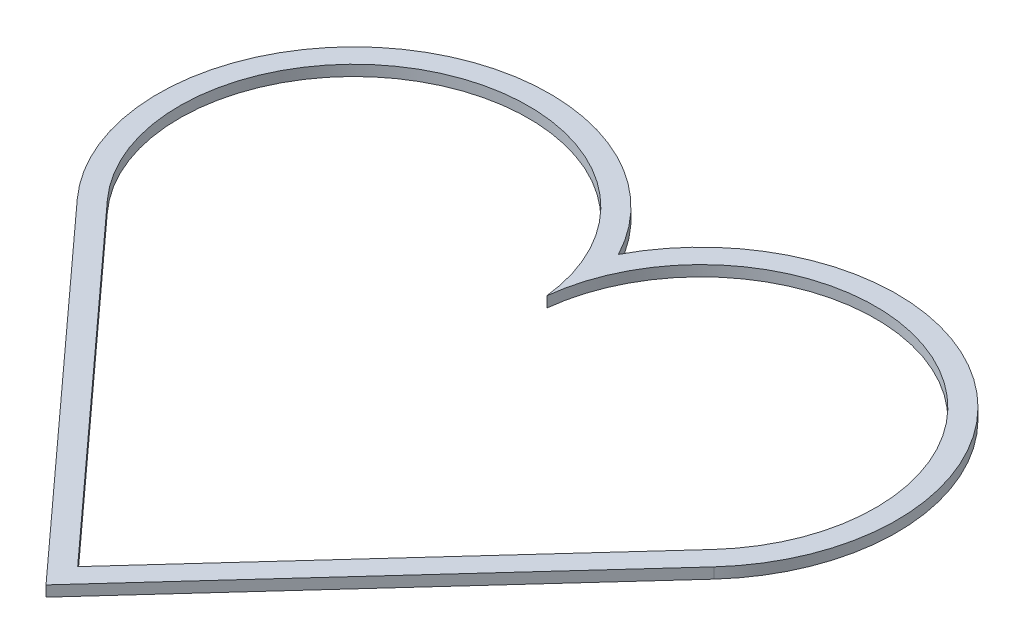
ISO-10303-21;
HEADER;
FILE_DESCRIPTION(('STEP AP214'),'2;1');
FILE_NAME('part.step','',(''),(''),'','','');
FILE_SCHEMA(('AUTOMOTIVE_DESIGN { 1 0 10303 214 1 1 1 1 }'));
ENDSEC;
DATA;
#1=APPLICATION_CONTEXT('core data for automotive mechanical design processes');
#2=APPLICATION_PROTOCOL_DEFINITION('international standard','automotive_design',2000,#1);
#3=PRODUCT_CONTEXT('',#1,'mechanical');
#4=PRODUCT('Part','Part','',(#3));
#5=PRODUCT_RELATED_PRODUCT_CATEGORY('part','',(#4));
#6=PRODUCT_DEFINITION_FORMATION('','',#4);
#7=PRODUCT_DEFINITION_CONTEXT('part definition',#1,'design');
#8=PRODUCT_DEFINITION('design','',#6,#7);
#9=PRODUCT_DEFINITION_SHAPE('','',#8);
#10=(LENGTH_UNIT() NAMED_UNIT(*) SI_UNIT(.MILLI.,.METRE.));
#11=(NAMED_UNIT(*) PLANE_ANGLE_UNIT() SI_UNIT($,.RADIAN.));
#12=(NAMED_UNIT(*) SI_UNIT($,.STERADIAN.) SOLID_ANGLE_UNIT());
#13=UNCERTAINTY_MEASURE_WITH_UNIT(LENGTH_MEASURE(1.E-05),#10,'distance_accuracy_value','');
#14=(GEOMETRIC_REPRESENTATION_CONTEXT(3) GLOBAL_UNCERTAINTY_ASSIGNED_CONTEXT((#13)) GLOBAL_UNIT_ASSIGNED_CONTEXT((#10,
#11,#12)) REPRESENTATION_CONTEXT('',''));
#15=CARTESIAN_POINT('',(0.,0.,0.));
#16=DIRECTION('',(0.,0.,1.));
#17=DIRECTION('',(1.,0.,0.));
#18=AXIS2_PLACEMENT_3D('',#15,#16,#17);
#19=CARTESIAN_POINT('',(-16.2888737415858,1.,-42.2315368312349));
#20=DIRECTION('',(0.,-1.,0.));
#21=DIRECTION('',(0.,0.,-1.));
#22=AXIS2_PLACEMENT_3D('',#19,#20,#21);
#23=PLANE('',#22);
#24=DIRECTION('',(0.673292320058697,0.,0.739376393827918));
#25=VECTOR('',#24,1.);
#26=CARTESIAN_POINT('',(0.,1.,2.97047796390376));
#27=LINE('',#26,#25);
#28=CARTESIAN_POINT('',(-29.8864201822029,1.,-29.8493135596602));
#29=VERTEX_POINT('',#28);
#30=CARTESIAN_POINT('',(0.,1.,2.97047796390376));
#31=VERTEX_POINT('',#30);
#32=EDGE_CURVE('E157',#29,#31,#27,.T.);
#33=ORIENTED_EDGE('',*,*,#32,.T.);
#34=DIRECTION('',(0.673292320058697,0.,-0.739376393827918));
#35=VECTOR('',#34,1.);
#36=CARTESIAN_POINT('',(0.,1.,2.97047796390376));
#37=LINE('',#36,#35);
#38=CARTESIAN_POINT('',(29.8864201822029,1.,-29.8493135596602));
#39=VERTEX_POINT('',#38);
#40=EDGE_CURVE('E161',#31,#39,#37,.T.);
#41=ORIENTED_EDGE('',*,*,#40,.T.);
#42=CARTESIAN_POINT('',(16.2888737415858,1.,-42.2315368312349));
#43=DIRECTION('',(0.,1.,0.));
#44=DIRECTION('',(0.,0.,1.));
#45=AXIS2_PLACEMENT_3D('',#42,#43,#44);
#46=CIRCLE('',#45,18.3905606861745);
#47=CARTESIAN_POINT('',(0.,1.,-50.7688264820868));
#48=VERTEX_POINT('',#47);
#49=EDGE_CURVE('E165',#39,#48,#46,.T.);
#50=ORIENTED_EDGE('',*,*,#49,.T.);
#51=CARTESIAN_POINT('',(-16.2888737415858,1.,-42.2315368312349));
#52=DIRECTION('',(0.,1.,0.));
#53=DIRECTION('',(0.,0.,-1.));
#54=AXIS2_PLACEMENT_3D('',#51,#52,#53);
#55=CIRCLE('',#54,18.3905606861745);
#56=EDGE_CURVE('E168',#48,#29,#55,.T.);
#57=ORIENTED_EDGE('',*,*,#56,.T.);
#58=EDGE_LOOP('',(#33,#41,#50,#57));
#59=FACE_BOUND('',#58,.T.);
#60=DIRECTION('',(0.673292320058697,0.,0.739376393827918));
#61=VECTOR('',#60,1.);
#62=CARTESIAN_POINT('',(0.,1.,0.));
#63=LINE('',#62,#61);
#64=CARTESIAN_POINT('',(-28.4076673945471,1.,-31.1958981997776));
#65=VERTEX_POINT('',#64);
#66=CARTESIAN_POINT('',(0.,1.,0.));
#67=VERTEX_POINT('',#66);
#68=EDGE_CURVE('E109',#65,#67,#63,.T.);
#69=ORIENTED_EDGE('',*,*,#68,.F.);
#70=CARTESIAN_POINT('',(-16.2888737415858,1.,-42.2315368312349));
#71=DIRECTION('',(0.,1.,0.));
#72=DIRECTION('',(0.,0.,-1.));
#73=AXIS2_PLACEMENT_3D('',#70,#71,#72);
#74=CIRCLE('',#73,16.3905606861745);
#75=CARTESIAN_POINT('',(0.,1.,-44.0544662971894));
#76=VERTEX_POINT('',#75);
#77=EDGE_CURVE('E135',#76,#65,#74,.T.);
#78=ORIENTED_EDGE('',*,*,#77,.F.);
#79=CARTESIAN_POINT('',(16.2888737415858,1.,-42.2315368312349));
#80=DIRECTION('',(0.,1.,0.));
#81=DIRECTION('',(0.,0.,1.));
#82=AXIS2_PLACEMENT_3D('',#79,#80,#81);
#83=CIRCLE('',#82,16.3905606861745);
#84=CARTESIAN_POINT('',(28.4076673945471,1.,-31.1958981997776));
#85=VERTEX_POINT('',#84);
#86=EDGE_CURVE('E131',#85,#76,#83,.T.);
#87=ORIENTED_EDGE('',*,*,#86,.F.);
#88=DIRECTION('',(0.673292320058697,0.,-0.739376393827918));
#89=VECTOR('',#88,1.);
#90=CARTESIAN_POINT('',(0.,1.,0.));
#91=LINE('',#90,#89);
#92=EDGE_CURVE('E118',#67,#85,#91,.T.);
#93=ORIENTED_EDGE('',*,*,#92,.F.);
#94=EDGE_LOOP('',(#69,#78,#87,#93));
#95=FACE_BOUND('',#94,.T.);
#96=ADVANCED_FACE('F43',(#59,#95),#23,.F.);
#97=CARTESIAN_POINT('',(-16.2888737415858,0.,-42.2315368312349));
#98=DIRECTION('',(0.,-1.,0.));
#99=DIRECTION('',(0.,0.,-1.));
#100=AXIS2_PLACEMENT_3D('',#97,#98,#99);
#101=PLANE('',#100);
#102=DIRECTION('',(0.673292320058697,0.,0.739376393827918));
#103=VECTOR('',#102,1.);
#104=CARTESIAN_POINT('',(0.,0.,2.97047796390376));
#105=LINE('',#104,#103);
#106=CARTESIAN_POINT('',(-29.8864201822029,0.,-29.8493135596602));
#107=VERTEX_POINT('',#106);
#108=CARTESIAN_POINT('',(0.,0.,2.97047796390376));
#109=VERTEX_POINT('',#108);
#110=EDGE_CURVE('E127',#107,#109,#105,.T.);
#111=ORIENTED_EDGE('',*,*,#110,.F.);
#112=CARTESIAN_POINT('',(-16.2888737415858,0.,-42.2315368312349));
#113=DIRECTION('',(0.,1.,0.));
#114=DIRECTION('',(0.,0.,-1.));
#115=AXIS2_PLACEMENT_3D('',#112,#113,#114);
#116=CIRCLE('',#115,18.3905606861745);
#117=CARTESIAN_POINT('',(0.,0.,-50.7688264820868));
#118=VERTEX_POINT('',#117);
#119=EDGE_CURVE('E162',#118,#107,#116,.T.);
#120=ORIENTED_EDGE('',*,*,#119,.F.);
#121=CARTESIAN_POINT('',(16.2888737415858,0.,-42.2315368312349));
#122=DIRECTION('',(0.,1.,0.));
#123=DIRECTION('',(0.,0.,1.));
#124=AXIS2_PLACEMENT_3D('',#121,#122,#123);
#125=CIRCLE('',#124,18.3905606861745);
#126=CARTESIAN_POINT('',(29.8864201822029,0.,-29.8493135596602));
#127=VERTEX_POINT('',#126);
#128=EDGE_CURVE('E178',#127,#118,#125,.T.);
#129=ORIENTED_EDGE('',*,*,#128,.F.);
#130=DIRECTION('',(0.673292320058697,0.,-0.739376393827918));
#131=VECTOR('',#130,1.);
#132=CARTESIAN_POINT('',(0.,0.,2.97047796390376));
#133=LINE('',#132,#131);
#134=EDGE_CURVE('E175',#109,#127,#133,.T.);
#135=ORIENTED_EDGE('',*,*,#134,.F.);
#136=EDGE_LOOP('',(#111,#120,#129,#135));
#137=FACE_BOUND('',#136,.T.);
#138=CARTESIAN_POINT('',(-16.2888737415858,0.,-42.2315368312349));
#139=DIRECTION('',(0.,1.,0.));
#140=DIRECTION('',(0.,0.,-1.));
#141=AXIS2_PLACEMENT_3D('',#138,#139,#140);
#142=CIRCLE('',#141,16.3905606861745);
#143=CARTESIAN_POINT('',(0.,0.,-44.0544662971894));
#144=VERTEX_POINT('',#143);
#145=CARTESIAN_POINT('',(-28.4076673945471,0.,-31.1958981997776));
#146=VERTEX_POINT('',#145);
#147=EDGE_CURVE('E119',#144,#146,#142,.T.);
#148=ORIENTED_EDGE('',*,*,#147,.T.);
#149=DIRECTION('',(0.673292320058697,0.,0.739376393827918));
#150=VECTOR('',#149,1.);
#151=CARTESIAN_POINT('',(0.,0.,0.));
#152=LINE('',#151,#150);
#153=CARTESIAN_POINT('',(0.,0.,0.));
#154=VERTEX_POINT('',#153);
#155=EDGE_CURVE('E67',#146,#154,#152,.T.);
#156=ORIENTED_EDGE('',*,*,#155,.T.);
#157=DIRECTION('',(0.673292320058697,0.,-0.739376393827918));
#158=VECTOR('',#157,1.);
#159=CARTESIAN_POINT('',(0.,0.,0.));
#160=LINE('',#159,#158);
#161=CARTESIAN_POINT('',(28.4076673945471,0.,-31.1958981997776));
#162=VERTEX_POINT('',#161);
#163=EDGE_CURVE('E125',#154,#162,#160,.T.);
#164=ORIENTED_EDGE('',*,*,#163,.T.);
#165=CARTESIAN_POINT('',(16.2888737415858,0.,-42.2315368312349));
#166=DIRECTION('',(0.,1.,0.));
#167=DIRECTION('',(0.,0.,1.));
#168=AXIS2_PLACEMENT_3D('',#165,#166,#167);
#169=CIRCLE('',#168,16.3905606861745);
#170=EDGE_CURVE('E144',#162,#144,#169,.T.);
#171=ORIENTED_EDGE('',*,*,#170,.T.);
#172=EDGE_LOOP('',(#148,#156,#164,#171));
#173=FACE_BOUND('',#172,.T.);
#174=ADVANCED_FACE('F201',(#137,#173),#101,.T.);
#175=CARTESIAN_POINT('',(0.,1.,2.97047796390376));
#176=DIRECTION('',(0.739376393827918,0.,-0.673292320058697));
#177=DIRECTION('',(-0.673292320058697,0.,-0.739376393827918));
#178=AXIS2_PLACEMENT_3D('',#175,#176,#177);
#179=PLANE('',#178);
#180=ORIENTED_EDGE('',*,*,#110,.T.);
#181=DIRECTION('',(0.,-1.,0.));
#182=VECTOR('',#181,1.);
#183=CARTESIAN_POINT('',(0.,1.,2.97047796390376));
#184=LINE('',#183,#182);
#185=EDGE_CURVE('E11',#31,#109,#184,.T.);
#186=ORIENTED_EDGE('',*,*,#185,.F.);
#187=ORIENTED_EDGE('',*,*,#32,.F.);
#188=DIRECTION('',(0.,-1.,0.));
#189=VECTOR('',#188,1.);
#190=CARTESIAN_POINT('',(-29.8864201822029,1.,-29.8493135596602));
#191=LINE('',#190,#189);
#192=EDGE_CURVE('E171',#29,#107,#191,.T.);
#193=ORIENTED_EDGE('',*,*,#192,.T.);
#194=EDGE_LOOP('',(#180,#186,#187,#193));
#195=FACE_BOUND('',#194,.T.);
#196=ADVANCED_FACE('F45',(#195),#179,.F.);
#197=CARTESIAN_POINT('',(0.,1.,2.97047796390376));
#198=DIRECTION('',(-0.739376393827918,0.,-0.673292320058697));
#199=DIRECTION('',(-0.673292320058697,0.,0.739376393827918));
#200=AXIS2_PLACEMENT_3D('',#197,#198,#199);
#201=PLANE('',#200);
#202=ORIENTED_EDGE('',*,*,#134,.T.);
#203=DIRECTION('',(0.,-1.,0.));
#204=VECTOR('',#203,1.);
#205=CARTESIAN_POINT('',(29.8864201822029,1.,-29.8493135596602));
#206=LINE('',#205,#204);
#207=EDGE_CURVE('E52',#39,#127,#206,.T.);
#208=ORIENTED_EDGE('',*,*,#207,.F.);
#209=ORIENTED_EDGE('',*,*,#40,.F.);
#210=ORIENTED_EDGE('',*,*,#185,.T.);
#211=EDGE_LOOP('',(#202,#208,#209,#210));
#212=FACE_BOUND('',#211,.T.);
#213=ADVANCED_FACE('F211',(#212),#201,.F.);
#214=CARTESIAN_POINT('',(16.2888737415858,1.,-42.2315368312349));
#215=DIRECTION('',(0.,-1.,0.));
#216=DIRECTION('',(0.,0.,-1.));
#217=AXIS2_PLACEMENT_3D('',#214,#215,#216);
#218=CYLINDRICAL_SURFACE('',#217,18.3905606861745);
#219=ORIENTED_EDGE('',*,*,#128,.T.);
#220=DIRECTION('',(0.,-1.,0.));
#221=VECTOR('',#220,1.);
#222=CARTESIAN_POINT('',(0.,1.,-50.7688264820868));
#223=LINE('',#222,#221);
#224=EDGE_CURVE('E186',#48,#118,#223,.T.);
#225=ORIENTED_EDGE('',*,*,#224,.F.);
#226=ORIENTED_EDGE('',*,*,#49,.F.);
#227=ORIENTED_EDGE('',*,*,#207,.T.);
#228=EDGE_LOOP('',(#219,#225,#226,#227));
#229=FACE_BOUND('',#228,.T.);
#230=ADVANCED_FACE('F195',(#229),#218,.T.);
#231=CARTESIAN_POINT('',(-16.2888737415858,1.,-42.2315368312349));
#232=DIRECTION('',(0.,-1.,0.));
#233=DIRECTION('',(0.,0.,-1.));
#234=AXIS2_PLACEMENT_3D('',#231,#232,#233);
#235=CYLINDRICAL_SURFACE('',#234,18.3905606861745);
#236=ORIENTED_EDGE('',*,*,#119,.T.);
#237=ORIENTED_EDGE('',*,*,#192,.F.);
#238=ORIENTED_EDGE('',*,*,#56,.F.);
#239=ORIENTED_EDGE('',*,*,#224,.T.);
#240=EDGE_LOOP('',(#236,#237,#238,#239));
#241=FACE_BOUND('',#240,.T.);
#242=ADVANCED_FACE('F205',(#241),#235,.T.);
#243=CARTESIAN_POINT('',(0.,1.,0.));
#244=DIRECTION('',(0.739376393827918,0.,-0.673292320058697));
#245=DIRECTION('',(-0.673292320058697,0.,-0.739376393827918));
#246=AXIS2_PLACEMENT_3D('',#243,#244,#245);
#247=PLANE('',#246);
#248=ORIENTED_EDGE('',*,*,#155,.F.);
#249=DIRECTION('',(0.,-1.,0.));
#250=VECTOR('',#249,1.);
#251=CARTESIAN_POINT('',(-28.4076673945471,1.,-31.1958981997776));
#252=LINE('',#251,#250);
#253=EDGE_CURVE('E113',#65,#146,#252,.T.);
#254=ORIENTED_EDGE('',*,*,#253,.F.);
#255=ORIENTED_EDGE('',*,*,#68,.T.);
#256=DIRECTION('',(0.,-1.,0.));
#257=VECTOR('',#256,1.);
#258=CARTESIAN_POINT('',(0.,1.,0.));
#259=LINE('',#258,#257);
#260=EDGE_CURVE('E112',#67,#154,#259,.T.);
#261=ORIENTED_EDGE('',*,*,#260,.T.);
#262=EDGE_LOOP('',(#248,#254,#255,#261));
#263=FACE_BOUND('',#262,.T.);
#264=ADVANCED_FACE('F111',(#263),#247,.T.);
#265=CARTESIAN_POINT('',(0.,1.,0.));
#266=DIRECTION('',(-0.739376393827918,0.,-0.673292320058697));
#267=DIRECTION('',(-0.673292320058697,0.,0.739376393827918));
#268=AXIS2_PLACEMENT_3D('',#265,#266,#267);
#269=PLANE('',#268);
#270=ORIENTED_EDGE('',*,*,#163,.F.);
#271=ORIENTED_EDGE('',*,*,#260,.F.);
#272=ORIENTED_EDGE('',*,*,#92,.T.);
#273=DIRECTION('',(0.,-1.,0.));
#274=VECTOR('',#273,1.);
#275=CARTESIAN_POINT('',(28.4076673945471,1.,-31.1958981997776));
#276=LINE('',#275,#274);
#277=EDGE_CURVE('E128',#85,#162,#276,.T.);
#278=ORIENTED_EDGE('',*,*,#277,.T.);
#279=EDGE_LOOP('',(#270,#271,#272,#278));
#280=FACE_BOUND('',#279,.T.);
#281=ADVANCED_FACE('F122',(#280),#269,.T.);
#282=CARTESIAN_POINT('',(16.2888737415858,1.,-42.2315368312349));
#283=DIRECTION('',(0.,-1.,0.));
#284=DIRECTION('',(0.,0.,-1.));
#285=AXIS2_PLACEMENT_3D('',#282,#283,#284);
#286=CYLINDRICAL_SURFACE('',#285,16.3905606861745);
#287=ORIENTED_EDGE('',*,*,#170,.F.);
#288=ORIENTED_EDGE('',*,*,#277,.F.);
#289=ORIENTED_EDGE('',*,*,#86,.T.);
#290=DIRECTION('',(0.,-1.,0.));
#291=VECTOR('',#290,1.);
#292=CARTESIAN_POINT('',(0.,1.,-44.0544662971894));
#293=LINE('',#292,#291);
#294=EDGE_CURVE('E59',#76,#144,#293,.T.);
#295=ORIENTED_EDGE('',*,*,#294,.T.);
#296=EDGE_LOOP('',(#287,#288,#289,#295));
#297=FACE_BOUND('',#296,.T.);
#298=ADVANCED_FACE('F234',(#297),#286,.F.);
#299=CARTESIAN_POINT('',(-16.2888737415858,1.,-42.2315368312349));
#300=DIRECTION('',(0.,-1.,0.));
#301=DIRECTION('',(0.,0.,-1.));
#302=AXIS2_PLACEMENT_3D('',#299,#300,#301);
#303=CYLINDRICAL_SURFACE('',#302,16.3905606861745);
#304=ORIENTED_EDGE('',*,*,#147,.F.);
#305=ORIENTED_EDGE('',*,*,#294,.F.);
#306=ORIENTED_EDGE('',*,*,#77,.T.);
#307=ORIENTED_EDGE('',*,*,#253,.T.);
#308=EDGE_LOOP('',(#304,#305,#306,#307));
#309=FACE_BOUND('',#308,.T.);
#310=ADVANCED_FACE('F238',(#309),#303,.F.);
#311=CLOSED_SHELL('',(#96,#174,#196,#213,#230,#242,#264,#281,#298,#310));
#312=MANIFOLD_SOLID_BREP('B2',#311);
#313=ADVANCED_BREP_SHAPE_REPRESENTATION('',(#18,#312),#14);
#314=SHAPE_DEFINITION_REPRESENTATION(#9,#313);
ENDSEC;
END-ISO-10303-21;
